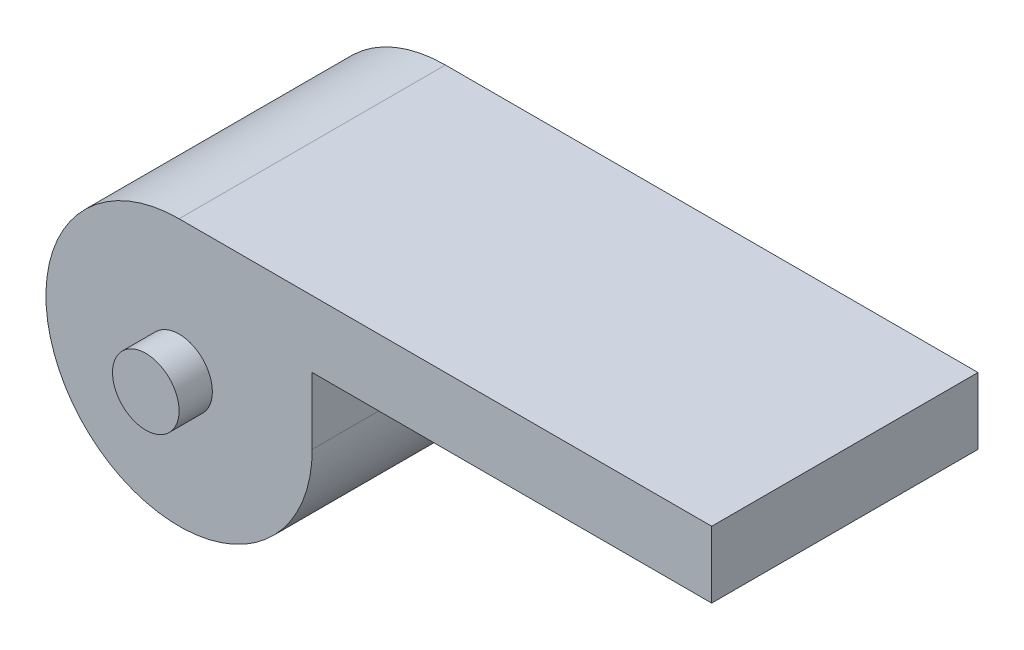
ISO-10303-21;
HEADER;
FILE_DESCRIPTION(('STEP AP214'),'2;1');
FILE_NAME('part.step','',(''),(''),'','','');
FILE_SCHEMA(('AUTOMOTIVE_DESIGN { 1 0 10303 214 1 1 1 1 }'));
ENDSEC;
DATA;
#1=APPLICATION_CONTEXT('core data for automotive mechanical design processes');
#2=APPLICATION_PROTOCOL_DEFINITION('international standard','automotive_design',2000,#1);
#3=PRODUCT_CONTEXT('',#1,'mechanical');
#4=PRODUCT('Part','Part','',(#3));
#5=PRODUCT_RELATED_PRODUCT_CATEGORY('part','',(#4));
#6=PRODUCT_DEFINITION_FORMATION('','',#4);
#7=PRODUCT_DEFINITION_CONTEXT('part definition',#1,'design');
#8=PRODUCT_DEFINITION('design','',#6,#7);
#9=PRODUCT_DEFINITION_SHAPE('','',#8);
#10=(LENGTH_UNIT() NAMED_UNIT(*) SI_UNIT(.MILLI.,.METRE.));
#11=(NAMED_UNIT(*) PLANE_ANGLE_UNIT() SI_UNIT($,.RADIAN.));
#12=(NAMED_UNIT(*) SI_UNIT($,.STERADIAN.) SOLID_ANGLE_UNIT());
#13=UNCERTAINTY_MEASURE_WITH_UNIT(LENGTH_MEASURE(1.E-05),#10,'distance_accuracy_value','');
#14=(GEOMETRIC_REPRESENTATION_CONTEXT(3) GLOBAL_UNCERTAINTY_ASSIGNED_CONTEXT((#13)) GLOBAL_UNIT_ASSIGNED_CONTEXT((#10,
#11,#12)) REPRESENTATION_CONTEXT('',''));
#15=CARTESIAN_POINT('',(0.,0.,0.));
#16=DIRECTION('',(0.,0.,1.));
#17=DIRECTION('',(1.,0.,0.));
#18=AXIS2_PLACEMENT_3D('',#15,#16,#17);
#19=CARTESIAN_POINT('',(0.,0.,12.7));
#20=DIRECTION('',(0.,0.,-1.));
#21=DIRECTION('',(-1.,0.,0.));
#22=AXIS2_PLACEMENT_3D('',#19,#20,#21);
#23=CYLINDRICAL_SURFACE('',#22,6.35);
#24=CARTESIAN_POINT('',(0.,0.,0.));
#25=DIRECTION('',(0.,0.,1.));
#26=DIRECTION('',(1.,0.,0.));
#27=AXIS2_PLACEMENT_3D('',#24,#25,#26);
#28=CIRCLE('',#27,6.35);
#29=CARTESIAN_POINT('',(0.,6.35,0.));
#30=VERTEX_POINT('',#29);
#31=CARTESIAN_POINT('',(6.35,0.,0.));
#32=VERTEX_POINT('',#31);
#33=EDGE_CURVE('E118',#30,#32,#28,.T.);
#34=ORIENTED_EDGE('',*,*,#33,.T.);
#35=DIRECTION('',(0.,0.,-1.));
#36=VECTOR('',#35,1.);
#37=CARTESIAN_POINT('',(6.35,0.,12.7));
#38=LINE('',#37,#36);
#39=CARTESIAN_POINT('',(6.35,0.,12.7));
#40=VERTEX_POINT('',#39);
#41=EDGE_CURVE('E11',#40,#32,#38,.T.);
#42=ORIENTED_EDGE('',*,*,#41,.F.);
#43=CARTESIAN_POINT('',(0.,0.,12.7));
#44=DIRECTION('',(0.,0.,1.));
#45=DIRECTION('',(1.,0.,0.));
#46=AXIS2_PLACEMENT_3D('',#43,#44,#45);
#47=CIRCLE('',#46,6.35);
#48=CARTESIAN_POINT('',(0.,6.35,12.7));
#49=VERTEX_POINT('',#48);
#50=EDGE_CURVE('E84',#49,#40,#47,.T.);
#51=ORIENTED_EDGE('',*,*,#50,.F.);
#52=DIRECTION('',(0.,0.,-1.));
#53=VECTOR('',#52,1.);
#54=CARTESIAN_POINT('',(0.,6.35,12.7));
#55=LINE('',#54,#53);
#56=EDGE_CURVE('E56',#49,#30,#55,.T.);
#57=ORIENTED_EDGE('',*,*,#56,.T.);
#58=EDGE_LOOP('',(#34,#42,#51,#57));
#59=FACE_BOUND('',#58,.T.);
#60=ADVANCED_FACE('F39',(#59),#23,.T.);
#61=CARTESIAN_POINT('',(6.35,0.,12.7));
#62=DIRECTION('',(1.,0.,0.));
#63=DIRECTION('',(0.,1.,0.));
#64=AXIS2_PLACEMENT_3D('',#61,#62,#63);
#65=PLANE('',#64);
#66=DIRECTION('',(0.,-1.,0.));
#67=VECTOR('',#66,1.);
#68=CARTESIAN_POINT('',(6.35,0.,0.));
#69=LINE('',#68,#67);
#70=CARTESIAN_POINT('',(6.35,3.175,0.));
#71=VERTEX_POINT('',#70);
#72=EDGE_CURVE('E121',#71,#32,#69,.T.);
#73=ORIENTED_EDGE('',*,*,#72,.F.);
#74=DIRECTION('',(0.,0.,-1.));
#75=VECTOR('',#74,1.);
#76=CARTESIAN_POINT('',(6.35,3.175,12.7));
#77=LINE('',#76,#75);
#78=CARTESIAN_POINT('',(6.35,3.175,12.7));
#79=VERTEX_POINT('',#78);
#80=EDGE_CURVE('E48',#79,#71,#77,.T.);
#81=ORIENTED_EDGE('',*,*,#80,.F.);
#82=DIRECTION('',(0.,-1.,0.));
#83=VECTOR('',#82,1.);
#84=CARTESIAN_POINT('',(6.35,0.,12.7));
#85=LINE('',#84,#83);
#86=EDGE_CURVE('E107',#79,#40,#85,.T.);
#87=ORIENTED_EDGE('',*,*,#86,.T.);
#88=ORIENTED_EDGE('',*,*,#41,.T.);
#89=EDGE_LOOP('',(#73,#81,#87,#88));
#90=FACE_BOUND('',#89,.T.);
#91=ADVANCED_FACE('F142',(#90),#65,.T.);
#92=CARTESIAN_POINT('',(0.,3.175,12.7));
#93=DIRECTION('',(0.,-1.,0.));
#94=DIRECTION('',(1.,0.,0.));
#95=AXIS2_PLACEMENT_3D('',#92,#93,#94);
#96=PLANE('',#95);
#97=DIRECTION('',(-1.,0.,0.));
#98=VECTOR('',#97,1.);
#99=CARTESIAN_POINT('',(0.,3.175,0.));
#100=LINE('',#99,#98);
#101=CARTESIAN_POINT('',(25.4,3.175,0.));
#102=VERTEX_POINT('',#101);
#103=EDGE_CURVE('E97',#102,#71,#100,.T.);
#104=ORIENTED_EDGE('',*,*,#103,.F.);
#105=DIRECTION('',(0.,0.,-1.));
#106=VECTOR('',#105,1.);
#107=CARTESIAN_POINT('',(25.4,3.175,12.7));
#108=LINE('',#107,#106);
#109=CARTESIAN_POINT('',(25.4,3.175,12.7));
#110=VERTEX_POINT('',#109);
#111=EDGE_CURVE('E92',#110,#102,#108,.T.);
#112=ORIENTED_EDGE('',*,*,#111,.F.);
#113=DIRECTION('',(-1.,0.,0.));
#114=VECTOR('',#113,1.);
#115=CARTESIAN_POINT('',(0.,3.175,12.7));
#116=LINE('',#115,#114);
#117=EDGE_CURVE('E95',#110,#79,#116,.T.);
#118=ORIENTED_EDGE('',*,*,#117,.T.);
#119=ORIENTED_EDGE('',*,*,#80,.T.);
#120=EDGE_LOOP('',(#104,#112,#118,#119));
#121=FACE_BOUND('',#120,.T.);
#122=ADVANCED_FACE('F94',(#121),#96,.T.);
#123=CARTESIAN_POINT('',(25.4,0.,12.7));
#124=DIRECTION('',(1.,0.,0.));
#125=DIRECTION('',(0.,0.,-1.));
#126=AXIS2_PLACEMENT_3D('',#123,#124,#125);
#127=PLANE('',#126);
#128=DIRECTION('',(0.,-1.,0.));
#129=VECTOR('',#128,1.);
#130=CARTESIAN_POINT('',(25.4,0.,0.));
#131=LINE('',#130,#129);
#132=CARTESIAN_POINT('',(25.4,6.35,0.));
#133=VERTEX_POINT('',#132);
#134=EDGE_CURVE('E128',#133,#102,#131,.T.);
#135=ORIENTED_EDGE('',*,*,#134,.F.);
#136=DIRECTION('',(0.,0.,-1.));
#137=VECTOR('',#136,1.);
#138=CARTESIAN_POINT('',(25.4,6.35,12.7));
#139=LINE('',#138,#137);
#140=CARTESIAN_POINT('',(25.4,6.35,12.7));
#141=VERTEX_POINT('',#140);
#142=EDGE_CURVE('E72',#141,#133,#139,.T.);
#143=ORIENTED_EDGE('',*,*,#142,.F.);
#144=DIRECTION('',(0.,-1.,0.));
#145=VECTOR('',#144,1.);
#146=CARTESIAN_POINT('',(25.4,0.,12.7));
#147=LINE('',#146,#145);
#148=EDGE_CURVE('E105',#141,#110,#147,.T.);
#149=ORIENTED_EDGE('',*,*,#148,.T.);
#150=ORIENTED_EDGE('',*,*,#111,.T.);
#151=EDGE_LOOP('',(#135,#143,#149,#150));
#152=FACE_BOUND('',#151,.T.);
#153=ADVANCED_FACE('F110',(#152),#127,.T.);
#154=CARTESIAN_POINT('',(0.,6.35,12.7));
#155=DIRECTION('',(0.,1.,0.));
#156=DIRECTION('',(0.,0.,1.));
#157=AXIS2_PLACEMENT_3D('',#154,#155,#156);
#158=PLANE('',#157);
#159=DIRECTION('',(1.,0.,0.));
#160=VECTOR('',#159,1.);
#161=CARTESIAN_POINT('',(0.,6.35,0.));
#162=LINE('',#161,#160);
#163=EDGE_CURVE('E131',#30,#133,#162,.T.);
#164=ORIENTED_EDGE('',*,*,#163,.F.);
#165=ORIENTED_EDGE('',*,*,#56,.F.);
#166=DIRECTION('',(1.,0.,0.));
#167=VECTOR('',#166,1.);
#168=CARTESIAN_POINT('',(0.,6.35,12.7));
#169=LINE('',#168,#167);
#170=EDGE_CURVE('E112',#49,#141,#169,.T.);
#171=ORIENTED_EDGE('',*,*,#170,.T.);
#172=ORIENTED_EDGE('',*,*,#142,.T.);
#173=EDGE_LOOP('',(#164,#165,#171,#172));
#174=FACE_BOUND('',#173,.T.);
#175=ADVANCED_FACE('F145',(#174),#158,.T.);
#176=CARTESIAN_POINT('',(0.,0.,12.7));
#177=DIRECTION('',(0.,0.,1.));
#178=DIRECTION('',(1.,0.,0.));
#179=AXIS2_PLACEMENT_3D('',#176,#177,#178);
#180=PLANE('',#179);
#181=CARTESIAN_POINT('',(0.,0.,12.7));
#182=DIRECTION('',(0.,0.,1.));
#183=DIRECTION('',(1.,0.,0.));
#184=AXIS2_PLACEMENT_3D('',#181,#182,#183);
#185=CIRCLE('',#184,1.5875);
#186=CARTESIAN_POINT('',(1.5875,0.,12.7));
#187=VERTEX_POINT('',#186);
#188=EDGE_CURVE('E135',#187,#187,#185,.T.);
#189=ORIENTED_EDGE('',*,*,#188,.F.);
#190=EDGE_LOOP('',(#189));
#191=FACE_BOUND('',#190,.T.);
#192=ORIENTED_EDGE('',*,*,#50,.T.);
#193=ORIENTED_EDGE('',*,*,#86,.F.);
#194=ORIENTED_EDGE('',*,*,#117,.F.);
#195=ORIENTED_EDGE('',*,*,#148,.F.);
#196=ORIENTED_EDGE('',*,*,#170,.F.);
#197=EDGE_LOOP('',(#192,#193,#194,#195,#196));
#198=FACE_BOUND('',#197,.T.);
#199=ADVANCED_FACE('F104',(#191,#198),#180,.T.);
#200=CARTESIAN_POINT('',(0.,0.,0.));
#201=DIRECTION('',(0.,0.,1.));
#202=DIRECTION('',(1.,0.,0.));
#203=AXIS2_PLACEMENT_3D('',#200,#201,#202);
#204=PLANE('',#203);
#205=CARTESIAN_POINT('',(0.,0.,0.));
#206=DIRECTION('',(0.,0.,1.));
#207=DIRECTION('',(1.,0.,0.));
#208=AXIS2_PLACEMENT_3D('',#205,#206,#207);
#209=CIRCLE('',#208,1.5875);
#210=CARTESIAN_POINT('',(1.5875,0.,0.));
#211=VERTEX_POINT('',#210);
#212=EDGE_CURVE('E122',#211,#211,#209,.T.);
#213=ORIENTED_EDGE('',*,*,#212,.T.);
#214=EDGE_LOOP('',(#213));
#215=FACE_BOUND('',#214,.T.);
#216=ORIENTED_EDGE('',*,*,#33,.F.);
#217=ORIENTED_EDGE('',*,*,#163,.T.);
#218=ORIENTED_EDGE('',*,*,#134,.T.);
#219=ORIENTED_EDGE('',*,*,#103,.T.);
#220=ORIENTED_EDGE('',*,*,#72,.T.);
#221=EDGE_LOOP('',(#216,#217,#218,#219,#220));
#222=FACE_BOUND('',#221,.T.);
#223=ADVANCED_FACE('F144',(#215,#222),#204,.F.);
#224=CARTESIAN_POINT('',(0.,0.,-1.5875));
#225=DIRECTION('',(0.,0.,1.));
#226=DIRECTION('',(1.,0.,0.));
#227=AXIS2_PLACEMENT_3D('',#224,#225,#226);
#228=PLANE('',#227);
#229=CARTESIAN_POINT('',(0.,0.,-1.5875));
#230=DIRECTION('',(0.,0.,1.));
#231=DIRECTION('',(1.,0.,0.));
#232=AXIS2_PLACEMENT_3D('',#229,#230,#231);
#233=CIRCLE('',#232,1.5875);
#234=CARTESIAN_POINT('',(1.5875,0.,-1.5875));
#235=VERTEX_POINT('',#234);
#236=EDGE_CURVE('E170',#235,#235,#233,.T.);
#237=ORIENTED_EDGE('',*,*,#236,.F.);
#238=EDGE_LOOP('',(#237));
#239=FACE_BOUND('',#238,.T.);
#240=ADVANCED_FACE('F191',(#239),#228,.F.);
#241=CARTESIAN_POINT('',(0.,0.,-1.5875));
#242=DIRECTION('',(0.,0.,1.));
#243=DIRECTION('',(1.,0.,0.));
#244=AXIS2_PLACEMENT_3D('',#241,#242,#243);
#245=CYLINDRICAL_SURFACE('',#244,1.5875);
#246=ORIENTED_EDGE('',*,*,#236,.T.);
#247=EDGE_LOOP('',(#246));
#248=FACE_BOUND('',#247,.T.);
#249=ORIENTED_EDGE('',*,*,#212,.F.);
#250=EDGE_LOOP('',(#249));
#251=FACE_BOUND('',#250,.T.);
#252=ADVANCED_FACE('F183',(#248,#251),#245,.T.);
#253=ORIENTED_EDGE('',*,*,#188,.T.);
#254=EDGE_LOOP('',(#253));
#255=FACE_BOUND('',#254,.T.);
#256=CARTESIAN_POINT('',(0.,0.,14.2875));
#257=DIRECTION('',(0.,0.,1.));
#258=DIRECTION('',(1.,0.,0.));
#259=AXIS2_PLACEMENT_3D('',#256,#257,#258);
#260=CIRCLE('',#259,1.5875);
#261=CARTESIAN_POINT('',(1.5875,0.,14.2875));
#262=VERTEX_POINT('',#261);
#263=EDGE_CURVE('E174',#262,#262,#260,.T.);
#264=ORIENTED_EDGE('',*,*,#263,.F.);
#265=EDGE_LOOP('',(#264));
#266=FACE_BOUND('',#265,.T.);
#267=ADVANCED_FACE('F181',(#255,#266),#245,.T.);
#268=CARTESIAN_POINT('',(0.,0.,14.2875));
#269=DIRECTION('',(0.,0.,1.));
#270=DIRECTION('',(1.,0.,0.));
#271=AXIS2_PLACEMENT_3D('',#268,#269,#270);
#272=PLANE('',#271);
#273=ORIENTED_EDGE('',*,*,#263,.T.);
#274=EDGE_LOOP('',(#273));
#275=FACE_BOUND('',#274,.T.);
#276=ADVANCED_FACE('F179',(#275),#272,.T.);
#277=CLOSED_SHELL('',(#60,#91,#122,#153,#175,#199,#223,#240,#252,#267,#276));
#278=MANIFOLD_SOLID_BREP('B2',#277);
#279=ADVANCED_BREP_SHAPE_REPRESENTATION('',(#18,#278),#14);
#280=SHAPE_DEFINITION_REPRESENTATION(#9,#279);
ENDSEC;
END-ISO-10303-21;
